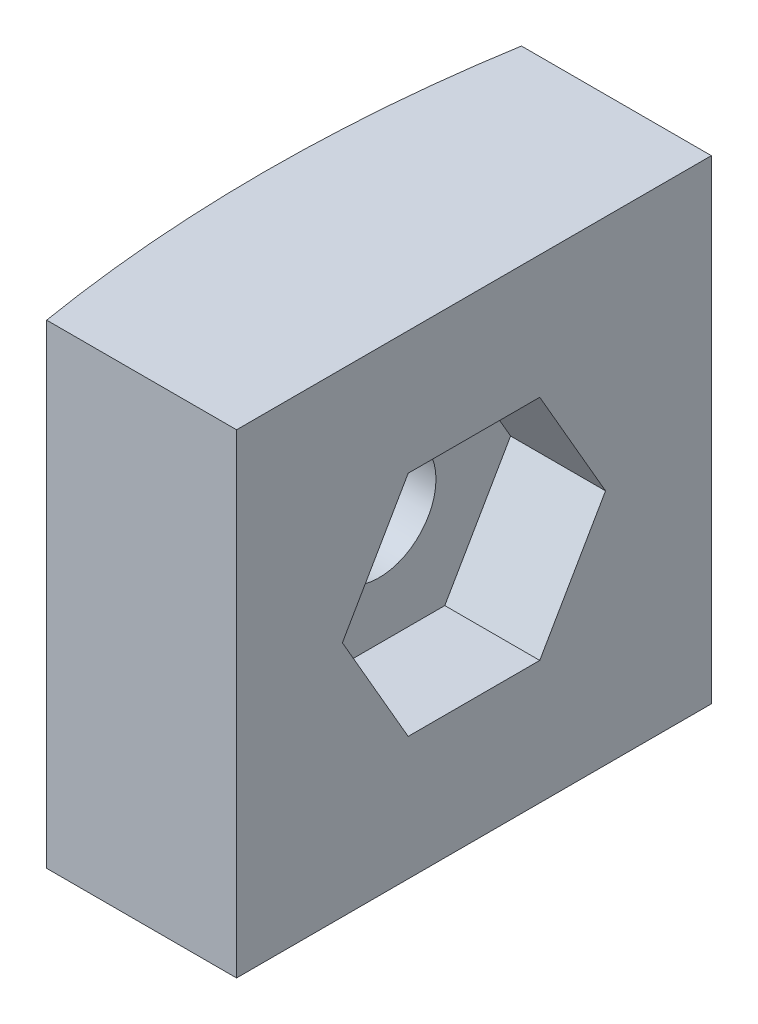
ISO-10303-21;
HEADER;
FILE_DESCRIPTION(('STEP AP214'),'2;1');
FILE_NAME('part.step','',(''),(''),'','','');
FILE_SCHEMA(('AUTOMOTIVE_DESIGN { 1 0 10303 214 1 1 1 1 }'));
ENDSEC;
DATA;
#1=APPLICATION_CONTEXT('core data for automotive mechanical design processes');
#2=APPLICATION_PROTOCOL_DEFINITION('international standard','automotive_design',2000,#1);
#3=PRODUCT_CONTEXT('',#1,'mechanical');
#4=PRODUCT('Part','Part','',(#3));
#5=PRODUCT_RELATED_PRODUCT_CATEGORY('part','',(#4));
#6=PRODUCT_DEFINITION_FORMATION('','',#4);
#7=PRODUCT_DEFINITION_CONTEXT('part definition',#1,'design');
#8=PRODUCT_DEFINITION('design','',#6,#7);
#9=PRODUCT_DEFINITION_SHAPE('','',#8);
#10=(LENGTH_UNIT() NAMED_UNIT(*) SI_UNIT(.MILLI.,.METRE.));
#11=(NAMED_UNIT(*) PLANE_ANGLE_UNIT() SI_UNIT($,.RADIAN.));
#12=(NAMED_UNIT(*) SI_UNIT($,.STERADIAN.) SOLID_ANGLE_UNIT());
#13=UNCERTAINTY_MEASURE_WITH_UNIT(LENGTH_MEASURE(1.E-05),#10,'distance_accuracy_value','');
#14=(GEOMETRIC_REPRESENTATION_CONTEXT(3) GLOBAL_UNCERTAINTY_ASSIGNED_CONTEXT((#13)) GLOBAL_UNIT_ASSIGNED_CONTEXT((#10,
#11,#12)) REPRESENTATION_CONTEXT('',''));
#15=CARTESIAN_POINT('',(0.,0.,0.));
#16=DIRECTION('',(0.,0.,1.));
#17=DIRECTION('',(1.,0.,0.));
#18=AXIS2_PLACEMENT_3D('',#15,#16,#17);
#19=CARTESIAN_POINT('',(-65.504745345666,25.,-11.4783815242943));
#20=DIRECTION('',(0.,0.,1.));
#21=DIRECTION('',(1.,0.,0.));
#22=AXIS2_PLACEMENT_3D('',#19,#20,#21);
#23=PLANE('',#22);
#24=DIRECTION('',(-1.,0.,0.));
#25=VECTOR('',#24,1.);
#26=CARTESIAN_POINT('',(-65.504745345666,0.,-11.4783815242943));
#27=LINE('',#26,#25);
#28=CARTESIAN_POINT('',(-60.504745345666,0.,-11.4783815242943));
#29=VERTEX_POINT('',#28);
#30=CARTESIAN_POINT('',(-70.504745345666,0.,-11.4783815242943));
#31=VERTEX_POINT('',#30);
#32=EDGE_CURVE('E77',#29,#31,#27,.T.);
#33=ORIENTED_EDGE('',*,*,#32,.T.);
#34=DIRECTION('',(0.,-1.,0.));
#35=VECTOR('',#34,1.);
#36=CARTESIAN_POINT('',(-70.504745345666,25.,-11.4783815242943));
#37=LINE('',#36,#35);
#38=CARTESIAN_POINT('',(-70.504745345666,25.,-11.4783815242943));
#39=VERTEX_POINT('',#38);
#40=EDGE_CURVE('E11',#39,#31,#37,.T.);
#41=ORIENTED_EDGE('',*,*,#40,.F.);
#42=DIRECTION('',(-1.,0.,0.));
#43=VECTOR('',#42,1.);
#44=CARTESIAN_POINT('',(-65.504745345666,25.,-11.4783815242943));
#45=LINE('',#44,#43);
#46=CARTESIAN_POINT('',(-60.504745345666,25.,-11.4783815242943));
#47=VERTEX_POINT('',#46);
#48=EDGE_CURVE('E90',#47,#39,#45,.T.);
#49=ORIENTED_EDGE('',*,*,#48,.F.);
#50=DIRECTION('',(0.,1.,0.));
#51=VECTOR('',#50,1.);
#52=CARTESIAN_POINT('',(-60.504745345666,25.,-11.4783815242943));
#53=LINE('',#52,#51);
#54=EDGE_CURVE('E137',#29,#47,#53,.T.);
#55=ORIENTED_EDGE('',*,*,#54,.F.);
#56=EDGE_LOOP('',(#33,#41,#49,#55));
#57=FACE_BOUND('',#56,.T.);
#58=ADVANCED_FACE('F33',(#57),#23,.F.);
#59=CARTESIAN_POINT('',(4.6630003967733,25.,1.02161847570574));
#60=DIRECTION('',(0.,-1.,0.));
#61=DIRECTION('',(0.,0.,-1.));
#62=AXIS2_PLACEMENT_3D('',#59,#60,#61);
#63=CYLINDRICAL_SURFACE('',#62,76.2);
#64=CARTESIAN_POINT('',(-71.4779215834602,12.5,-1.97838152429426));
#65=CARTESIAN_POINT('',(-71.4779223791835,12.6684412410957,-1.97837407626421));
#66=CARTESIAN_POINT('',(-71.4784865352579,12.8370029558818,-1.96414766882511));
#67=CARTESIAN_POINT('',(-71.4806826865875,13.1694793004812,-1.90759581760817));
#68=CARTESIAN_POINT('',(-71.4823159503,13.3333881685322,-1.86523699486931));
#69=CARTESIAN_POINT('',(-71.4864650192497,13.6516942659507,-1.75363235331121));
#70=CARTESIAN_POINT('',(-71.4889803853069,13.8060961837375,-1.68439991246423));
#71=CARTESIAN_POINT('',(-71.4946096692025,14.1010440402986,-1.5210330359289));
#72=CARTESIAN_POINT('',(-71.4977234428412,14.2415933048603,-1.42690459743609));
#73=CARTESIAN_POINT('',(-71.5042011314695,14.5049847229862,-1.21634467104541));
#74=CARTESIAN_POINT('',(-71.5075651926932,14.627816399668,-1.09990008100219));
#75=CARTESIAN_POINT('',(-71.5141629781209,14.8521970571698,-0.848038161265433));
#76=CARTESIAN_POINT('',(-71.5173966970777,14.9537451818938,-0.712620068759224));
#77=CARTESIAN_POINT('',(-71.5233702921472,15.1327000000221,-0.426606713137542));
#78=CARTESIAN_POINT('',(-71.5261100166634,15.2100992879657,-0.276006813078393));
#79=CARTESIAN_POINT('',(-71.5307854831212,15.3385115956986,0.0360623740424597));
#80=CARTESIAN_POINT('',(-71.5327212294474,15.3895247593856,0.197531601822417));
#81=CARTESIAN_POINT('',(-71.5355696561206,15.4636911399376,0.526666440487999));
#82=CARTESIAN_POINT('',(-71.5364828711725,15.4868589182555,0.694328765433289));
#83=CARTESIAN_POINT('',(-71.5371850990962,15.5047217847356,1.03116508290998));
#84=CARTESIAN_POINT('',(-71.5369741182261,15.4994170313968,1.20033906702114));
#85=CARTESIAN_POINT('',(-71.5354521872631,15.4604975878984,1.53529786937751));
#86=CARTESIAN_POINT('',(-71.5341418468294,15.4268985885142,1.70108451391378));
#87=CARTESIAN_POINT('',(-71.5305695429985,15.3323687045179,2.02466254071024));
#88=CARTESIAN_POINT('',(-71.5283075767342,15.2714377375573,2.18245389887983));
#89=CARTESIAN_POINT('',(-71.5230858484435,15.1239555635658,2.48561278576851));
#90=CARTESIAN_POINT('',(-71.5201258910674,15.0373971823457,2.63097682085317));
#91=CARTESIAN_POINT('',(-71.5138416621374,14.8411225325387,2.90511646763926));
#92=CARTESIAN_POINT('',(-71.5105173890436,14.7314061660684,3.03389200922129));
#93=CARTESIAN_POINT('',(-71.5038763901206,14.4918412253314,3.27129068139133));
#94=CARTESIAN_POINT('',(-71.5005596709443,14.3619790390683,3.3799000764343));
#95=CARTESIAN_POINT('',(-71.4943099744649,14.085856695502,3.57377766450101));
#96=CARTESIAN_POINT('',(-71.4913769972384,13.939596534929,3.65904585287052));
#97=CARTESIAN_POINT('',(-71.4862256831765,13.6348220698647,3.80381920822661));
#98=CARTESIAN_POINT('',(-71.4840073594999,13.4763075398039,3.86332390084437));
#99=CARTESIAN_POINT('',(-71.4805360288411,13.1515275791352,3.95487216951777));
#100=CARTESIAN_POINT('',(-71.4792830173507,12.9852621847289,3.98691587382067));
#101=CARTESIAN_POINT('',(-71.4778844284352,12.6498197241709,4.02261565477156));
#102=CARTESIAN_POINT('',(-71.4777381080826,12.4806446877541,4.02629077542969));
#103=CARTESIAN_POINT('',(-71.478567462197,12.1440801577018,4.00519872229129));
#104=CARTESIAN_POINT('',(-71.4795431343858,11.9766906604419,3.98043160624097));
#105=CARTESIAN_POINT('',(-71.4825058167939,11.6485020640001,3.90317390868784));
#106=CARTESIAN_POINT('',(-71.4844925103674,11.4877009184144,3.85069200709052));
#107=CARTESIAN_POINT('',(-71.4892530234883,11.1771906569888,3.71950329818787));
#108=CARTESIAN_POINT('',(-71.4920268458307,11.0274815805368,3.6407963977631));
#109=CARTESIAN_POINT('',(-71.4980507592919,10.7433174674153,3.45934288802212));
#110=CARTESIAN_POINT('',(-71.5013011039133,10.6088706179911,3.35658346565843));
#111=CARTESIAN_POINT('',(-71.5079107799693,10.3591296976402,3.12996064880762));
#112=CARTESIAN_POINT('',(-71.5112701118516,10.2438357054238,3.00609716759575));
#113=CARTESIAN_POINT('',(-71.517721258469,10.0356095293102,2.74070059962868));
#114=CARTESIAN_POINT('',(-71.5208129256085,9.94268963324917,2.59915786795123));
#115=CARTESIAN_POINT('',(-71.5263781595644,9.78193329025788,2.30246966223248));
#116=CARTESIAN_POINT('',(-71.528851728303,9.71409676532,2.14732423049651));
#117=CARTESIAN_POINT('',(-71.5329012502267,9.60545433631828,1.82788071123102));
#118=CARTESIAN_POINT('',(-71.5344774663705,9.56464051299399,1.66358532049953));
#119=CARTESIAN_POINT('',(-71.5365556643637,9.51117609035381,1.33046763983894));
#120=CARTESIAN_POINT('',(-71.5370576492328,9.49852541187114,1.16164536263629));
#121=CARTESIAN_POINT('',(-71.5369308217157,9.5017472760387,0.824388499979557));
#122=CARTESIAN_POINT('',(-71.5363027750645,9.51760050379119,0.655953729375863));
#123=CARTESIAN_POINT('',(-71.5339881305341,9.57734033903583,0.324138664467058));
#124=CARTESIAN_POINT('',(-71.5323015305943,9.62122700109815,0.16075838000171));
#125=CARTESIAN_POINT('',(-71.5280596623478,9.73578447538113,-0.156315317983527));
#126=CARTESIAN_POINT('',(-71.5255043820423,9.80645565757024,-0.310008597664832));
#127=CARTESIAN_POINT('',(-71.5198128493205,9.97257157532319,-0.60334765344264));
#128=CARTESIAN_POINT('',(-71.5166766166216,10.0680154701514,-0.742993906043622));
#129=CARTESIAN_POINT('',(-71.5101740732465,10.2810324665853,-1.00436868827755));
#130=CARTESIAN_POINT('',(-71.5068076323944,10.3986181557225,-1.12608695542022));
#131=CARTESIAN_POINT('',(-71.5002246444016,10.6525890682001,-1.34809079751844));
#132=CARTESIAN_POINT('',(-71.4970081344846,10.7889789271738,-1.44837107195033));
#133=CARTESIAN_POINT('',(-71.4910862235788,11.0767616954103,-1.62468147114229));
#134=CARTESIAN_POINT('',(-71.4883812200234,11.2281661326919,-1.70069277055733));
#135=CARTESIAN_POINT('',(-71.4837941577894,11.5414829773977,-1.82612728145381));
#136=CARTESIAN_POINT('',(-71.4819111220437,11.7033826447252,-1.87558207665013));
#137=CARTESIAN_POINT('',(-71.479681758016,11.9719152230185,-1.93344802536783));
#138=CARTESIAN_POINT('',(-71.4790245777926,12.0768065764502,-1.95027675972112));
#139=CARTESIAN_POINT('',(-71.4781442399397,12.2877826772794,-1.97274585274192));
#140=CARTESIAN_POINT('',(-71.4779210820855,12.3938674240594,-1.97838621719851));
#141=CARTESIAN_POINT('',(-71.4779215834602,12.5,-1.97838152429426));
#142=B_SPLINE_CURVE_WITH_KNOTS('',3,(#64,#65,#66,#67,#68,#69,#70,#71,#72,#73,#74,#75,#76,#77,
#78,#79,#80,#81,#82,#83,#84,#85,#86,#87,#88,#89,#90,#91,#92,#93,#94,#95,#96,#97,#98,#99,#100,
#101,#102,#103,#104,#105,#106,#107,#108,#109,#110,#111,#112,#113,#114,#115,#116,#117,#118,#119,
#120,#121,#122,#123,#124,#125,#126,#127,#128,#129,#130,#131,#132,#133,#134,#135,#136,#137,#138,
#139,#140,#141),.UNSPECIFIED.,.T.,.F.,(4,2,2,2,2,2,2,2,2,2,2,2,2,2,2,2,2,2,2,2,2,2,2,2,2,2,2,2,
2,2,2,2,2,2,2,2,2,2,4),(0.,0.504936314698829,1.01047280650805,1.5157579589704,2.02092150400216,
2.52638255176425,3.03186392696909,3.5375001606292,4.04313363675254,4.54850258193265,
5.05386871385969,5.55895477581716,6.06404235955899,6.56927147242995,7.07450272082898,
7.58007683948578,8.08565105895381,8.59123458688073,9.0968157536378,9.60205749100909,
10.1072982025907,10.6123807732028,11.1174651372757,11.6228191802746,12.1281753000188,
12.6338083311415,13.1394397897665,13.6449230026043,14.1504047945241,14.6555441895202,
15.1606845678287,15.6658319237802,16.1709621382961,16.6763803892859,17.1819234603067,
17.6878577316328,18.193188953912,18.5113427453767,18.8294963722221),.UNSPECIFIED.);
#143=CARTESIAN_POINT('',(-71.4779215834602,12.5,-1.97838152429426));
#144=VERTEX_POINT('',#143);
#145=EDGE_CURVE('E95',#144,#144,#142,.T.);
#146=ORIENTED_EDGE('',*,*,#145,.T.);
#147=EDGE_LOOP('',(#146));
#148=FACE_BOUND('',#147,.T.);
#149=CARTESIAN_POINT('',(4.6630003967733,0.,1.02161847570574));
#150=DIRECTION('',(0.,1.,0.));
#151=DIRECTION('',(0.,0.,1.));
#152=AXIS2_PLACEMENT_3D('',#149,#150,#151);
#153=CIRCLE('',#152,76.2);
#154=CARTESIAN_POINT('',(-70.504745345666,0.,13.5216184757057));
#155=VERTEX_POINT('',#154);
#156=EDGE_CURVE('E67',#31,#155,#153,.T.);
#157=ORIENTED_EDGE('',*,*,#156,.T.);
#158=DIRECTION('',(0.,-1.,0.));
#159=VECTOR('',#158,1.);
#160=CARTESIAN_POINT('',(-70.504745345666,25.,13.5216184757057));
#161=LINE('',#160,#159);
#162=CARTESIAN_POINT('',(-70.504745345666,25.,13.5216184757057));
#163=VERTEX_POINT('',#162);
#164=EDGE_CURVE('E40',#163,#155,#161,.T.);
#165=ORIENTED_EDGE('',*,*,#164,.F.);
#166=CARTESIAN_POINT('',(4.6630003967733,25.,1.02161847570574));
#167=DIRECTION('',(0.,1.,0.));
#168=DIRECTION('',(0.,0.,1.));
#169=AXIS2_PLACEMENT_3D('',#166,#167,#168);
#170=CIRCLE('',#169,76.2);
#171=EDGE_CURVE('E56',#39,#163,#170,.T.);
#172=ORIENTED_EDGE('',*,*,#171,.F.);
#173=ORIENTED_EDGE('',*,*,#40,.T.);
#174=EDGE_LOOP('',(#157,#165,#172,#173));
#175=FACE_BOUND('',#174,.T.);
#176=ADVANCED_FACE('F69',(#148,#175),#63,.T.);
#177=CARTESIAN_POINT('',(-65.504745345666,25.,13.5216184757057));
#178=DIRECTION('',(0.,0.,-1.));
#179=DIRECTION('',(-1.,0.,0.));
#180=AXIS2_PLACEMENT_3D('',#177,#178,#179);
#181=PLANE('',#180);
#182=DIRECTION('',(1.,0.,0.));
#183=VECTOR('',#182,1.);
#184=CARTESIAN_POINT('',(-65.504745345666,0.,13.5216184757057));
#185=LINE('',#184,#183);
#186=CARTESIAN_POINT('',(-60.504745345666,0.,13.5216184757057));
#187=VERTEX_POINT('',#186);
#188=EDGE_CURVE('E76',#155,#187,#185,.T.);
#189=ORIENTED_EDGE('',*,*,#188,.T.);
#190=DIRECTION('',(0.,-1.,0.));
#191=VECTOR('',#190,1.);
#192=CARTESIAN_POINT('',(-60.504745345666,25.,13.5216184757057));
#193=LINE('',#192,#191);
#194=CARTESIAN_POINT('',(-60.504745345666,25.,13.5216184757057));
#195=VERTEX_POINT('',#194);
#196=EDGE_CURVE('E144',#195,#187,#193,.T.);
#197=ORIENTED_EDGE('',*,*,#196,.F.);
#198=DIRECTION('',(1.,0.,0.));
#199=VECTOR('',#198,1.);
#200=CARTESIAN_POINT('',(-65.504745345666,25.,13.5216184757057));
#201=LINE('',#200,#199);
#202=EDGE_CURVE('E85',#163,#195,#201,.T.);
#203=ORIENTED_EDGE('',*,*,#202,.F.);
#204=ORIENTED_EDGE('',*,*,#164,.T.);
#205=EDGE_LOOP('',(#189,#197,#203,#204));
#206=FACE_BOUND('',#205,.T.);
#207=ADVANCED_FACE('F81',(#206),#181,.F.);
#208=CARTESIAN_POINT('',(-65.504745345666,25.,-11.4783815242943));
#209=DIRECTION('',(-1.,0.,0.));
#210=DIRECTION('',(0.,0.,1.));
#211=AXIS2_PLACEMENT_3D('',#208,#209,#210);
#212=PLANE('',#211);
#213=DIRECTION('',(0.,-0.866025403784439,-0.5));
#214=VECTOR('',#213,1.);
#215=CARTESIAN_POINT('',(-65.504745345666,12.5,7.94982170598125));
#216=LINE('',#215,#214);
#217=CARTESIAN_POINT('',(-65.504745345666,12.5,7.94982170598125));
#218=VERTEX_POINT('',#217);
#219=CARTESIAN_POINT('',(-65.504745345666,6.5,4.4857200908435));
#220=VERTEX_POINT('',#219);
#221=EDGE_CURVE('E169',#218,#220,#216,.T.);
#222=ORIENTED_EDGE('',*,*,#221,.T.);
#223=DIRECTION('',(0.,0.,-1.));
#224=VECTOR('',#223,1.);
#225=CARTESIAN_POINT('',(-65.504745345666,6.5,4.4857200908435));
#226=LINE('',#225,#224);
#227=CARTESIAN_POINT('',(-65.504745345666,6.5,-2.44248313943202));
#228=VERTEX_POINT('',#227);
#229=EDGE_CURVE('E47',#220,#228,#226,.T.);
#230=ORIENTED_EDGE('',*,*,#229,.T.);
#231=DIRECTION('',(0.,0.866025403784439,-0.5));
#232=VECTOR('',#231,1.);
#233=CARTESIAN_POINT('',(-65.504745345666,6.5,-2.44248313943202));
#234=LINE('',#233,#232);
#235=CARTESIAN_POINT('',(-65.504745345666,12.5,-5.90658475456977));
#236=VERTEX_POINT('',#235);
#237=EDGE_CURVE('E181',#228,#236,#234,.T.);
#238=ORIENTED_EDGE('',*,*,#237,.T.);
#239=DIRECTION('',(0.,0.866025403784439,0.5));
#240=VECTOR('',#239,1.);
#241=CARTESIAN_POINT('',(-65.504745345666,12.5,-5.90658475456977));
#242=LINE('',#241,#240);
#243=CARTESIAN_POINT('',(-65.504745345666,18.5,-2.44248313943202));
#244=VERTEX_POINT('',#243);
#245=EDGE_CURVE('E178',#236,#244,#242,.T.);
#246=ORIENTED_EDGE('',*,*,#245,.T.);
#247=DIRECTION('',(0.,0.,1.));
#248=VECTOR('',#247,1.);
#249=CARTESIAN_POINT('',(-65.504745345666,18.5,-2.44248313943202));
#250=LINE('',#249,#248);
#251=CARTESIAN_POINT('',(-65.504745345666,18.5,4.48572009084349));
#252=VERTEX_POINT('',#251);
#253=EDGE_CURVE('E175',#244,#252,#250,.T.);
#254=ORIENTED_EDGE('',*,*,#253,.T.);
#255=DIRECTION('',(0.,-0.866025403784439,0.5));
#256=VECTOR('',#255,1.);
#257=CARTESIAN_POINT('',(-65.504745345666,18.5,4.48572009084349));
#258=LINE('',#257,#256);
#259=EDGE_CURVE('E172',#252,#218,#258,.T.);
#260=ORIENTED_EDGE('',*,*,#259,.T.);
#261=EDGE_LOOP('',(#222,#230,#238,#246,#254,#260));
#262=FACE_BOUND('',#261,.T.);
#263=CARTESIAN_POINT('',(-65.504745345666,12.5,1.02161847570574));
#264=DIRECTION('',(1.,0.,0.));
#265=DIRECTION('',(0.,0.,-1.));
#266=AXIS2_PLACEMENT_3D('',#263,#264,#265);
#267=CIRCLE('',#266,3.);
#268=CARTESIAN_POINT('',(-65.504745345666,12.5,-1.97838152429426));
#269=VERTEX_POINT('',#268);
#270=EDGE_CURVE('E104',#269,#269,#267,.T.);
#271=ORIENTED_EDGE('',*,*,#270,.F.);
#272=EDGE_LOOP('',(#271));
#273=FACE_BOUND('',#272,.T.);
#274=ADVANCED_FACE('F119',(#262,#273),#212,.F.);
#275=CARTESIAN_POINT('',(4.6630003967733,25.,1.02161847570574));
#276=DIRECTION('',(0.,1.,0.));
#277=DIRECTION('',(0.,0.,1.));
#278=AXIS2_PLACEMENT_3D('',#275,#276,#277);
#279=PLANE('',#278);
#280=ORIENTED_EDGE('',*,*,#48,.T.);
#281=ORIENTED_EDGE('',*,*,#171,.T.);
#282=ORIENTED_EDGE('',*,*,#202,.T.);
#283=DIRECTION('',(0.,0.,1.));
#284=VECTOR('',#283,1.);
#285=CARTESIAN_POINT('',(-60.504745345666,25.,13.5216184757057));
#286=LINE('',#285,#284);
#287=EDGE_CURVE('E146',#47,#195,#286,.T.);
#288=ORIENTED_EDGE('',*,*,#287,.F.);
#289=EDGE_LOOP('',(#280,#281,#282,#288));
#290=FACE_BOUND('',#289,.T.);
#291=ADVANCED_FACE('F116',(#290),#279,.T.);
#292=CARTESIAN_POINT('',(4.6630003967733,0.,1.02161847570574));
#293=DIRECTION('',(0.,1.,0.));
#294=DIRECTION('',(0.,0.,1.));
#295=AXIS2_PLACEMENT_3D('',#292,#293,#294);
#296=PLANE('',#295);
#297=ORIENTED_EDGE('',*,*,#32,.F.);
#298=DIRECTION('',(0.,0.,-1.));
#299=VECTOR('',#298,1.);
#300=CARTESIAN_POINT('',(-60.504745345666,0.,13.5216184757057));
#301=LINE('',#300,#299);
#302=EDGE_CURVE('E89',#187,#29,#301,.T.);
#303=ORIENTED_EDGE('',*,*,#302,.F.);
#304=ORIENTED_EDGE('',*,*,#188,.F.);
#305=ORIENTED_EDGE('',*,*,#156,.F.);
#306=EDGE_LOOP('',(#297,#303,#304,#305));
#307=FACE_BOUND('',#306,.T.);
#308=ADVANCED_FACE('F87',(#307),#296,.F.);
#309=CARTESIAN_POINT('',(-90.504745345666,12.5,1.02161847570574));
#310=DIRECTION('',(1.,0.,0.));
#311=DIRECTION('',(0.,0.,-1.));
#312=AXIS2_PLACEMENT_3D('',#309,#310,#311);
#313=CYLINDRICAL_SURFACE('',#312,3.);
#314=ORIENTED_EDGE('',*,*,#270,.T.);
#315=EDGE_LOOP('',(#314));
#316=FACE_BOUND('',#315,.T.);
#317=ORIENTED_EDGE('',*,*,#145,.F.);
#318=EDGE_LOOP('',(#317));
#319=FACE_BOUND('',#318,.T.);
#320=ADVANCED_FACE('F108',(#316,#319),#313,.F.);
#321=CARTESIAN_POINT('',(-60.504745345666,0.,0.));
#322=DIRECTION('',(-1.,0.,0.));
#323=DIRECTION('',(0.,0.,1.));
#324=AXIS2_PLACEMENT_3D('',#321,#322,#323);
#325=PLANE('',#324);
#326=ORIENTED_EDGE('',*,*,#287,.T.);
#327=ORIENTED_EDGE('',*,*,#196,.T.);
#328=ORIENTED_EDGE('',*,*,#302,.T.);
#329=ORIENTED_EDGE('',*,*,#54,.T.);
#330=EDGE_LOOP('',(#326,#327,#328,#329));
#331=FACE_BOUND('',#330,.T.);
#332=DIRECTION('',(0.,0.866025403784439,-0.5));
#333=VECTOR('',#332,1.);
#334=CARTESIAN_POINT('',(-60.504745345666,6.5,-2.44248313943202));
#335=LINE('',#334,#333);
#336=CARTESIAN_POINT('',(-60.504745345666,6.5,-2.44248313943202));
#337=VERTEX_POINT('',#336);
#338=CARTESIAN_POINT('',(-60.504745345666,12.5,-5.90658475456977));
#339=VERTEX_POINT('',#338);
#340=EDGE_CURVE('E168',#337,#339,#335,.T.);
#341=ORIENTED_EDGE('',*,*,#340,.F.);
#342=DIRECTION('',(0.,0.,-1.));
#343=VECTOR('',#342,1.);
#344=CARTESIAN_POINT('',(-60.504745345666,6.5,4.4857200908435));
#345=LINE('',#344,#343);
#346=CARTESIAN_POINT('',(-60.504745345666,6.5,4.4857200908435));
#347=VERTEX_POINT('',#346);
#348=EDGE_CURVE('E166',#347,#337,#345,.T.);
#349=ORIENTED_EDGE('',*,*,#348,.F.);
#350=DIRECTION('',(0.,-0.866025403784439,-0.5));
#351=VECTOR('',#350,1.);
#352=CARTESIAN_POINT('',(-60.504745345666,12.5,7.94982170598125));
#353=LINE('',#352,#351);
#354=CARTESIAN_POINT('',(-60.504745345666,12.5,7.94982170598125));
#355=VERTEX_POINT('',#354);
#356=EDGE_CURVE('E186',#355,#347,#353,.T.);
#357=ORIENTED_EDGE('',*,*,#356,.F.);
#358=DIRECTION('',(0.,-0.866025403784439,0.5));
#359=VECTOR('',#358,1.);
#360=CARTESIAN_POINT('',(-60.504745345666,18.5,4.48572009084349));
#361=LINE('',#360,#359);
#362=CARTESIAN_POINT('',(-60.504745345666,18.5,4.48572009084349));
#363=VERTEX_POINT('',#362);
#364=EDGE_CURVE('E189',#363,#355,#361,.T.);
#365=ORIENTED_EDGE('',*,*,#364,.F.);
#366=DIRECTION('',(0.,0.,1.));
#367=VECTOR('',#366,1.);
#368=CARTESIAN_POINT('',(-60.504745345666,18.5,-2.44248313943202));
#369=LINE('',#368,#367);
#370=CARTESIAN_POINT('',(-60.504745345666,18.5,-2.44248313943202));
#371=VERTEX_POINT('',#370);
#372=EDGE_CURVE('E192',#371,#363,#369,.T.);
#373=ORIENTED_EDGE('',*,*,#372,.F.);
#374=DIRECTION('',(0.,0.866025403784439,0.5));
#375=VECTOR('',#374,1.);
#376=CARTESIAN_POINT('',(-60.504745345666,12.5,-5.90658475456977));
#377=LINE('',#376,#375);
#378=EDGE_CURVE('E195',#339,#371,#377,.T.);
#379=ORIENTED_EDGE('',*,*,#378,.F.);
#380=EDGE_LOOP('',(#341,#349,#357,#365,#373,#379));
#381=FACE_BOUND('',#380,.T.);
#382=ADVANCED_FACE('F113',(#331,#381),#325,.F.);
#383=CARTESIAN_POINT('',(-60.504745345666,6.5,-2.44248313943202));
#384=DIRECTION('',(0.,0.5,0.866025403784439));
#385=DIRECTION('',(0.,-0.866025403784439,0.5));
#386=AXIS2_PLACEMENT_3D('',#383,#384,#385);
#387=PLANE('',#386);
#388=ORIENTED_EDGE('',*,*,#237,.F.);
#389=DIRECTION('',(-1.,0.,0.));
#390=VECTOR('',#389,1.);
#391=CARTESIAN_POINT('',(-60.504745345666,6.5,-2.44248313943202));
#392=LINE('',#391,#390);
#393=EDGE_CURVE('E164',#337,#228,#392,.T.);
#394=ORIENTED_EDGE('',*,*,#393,.F.);
#395=ORIENTED_EDGE('',*,*,#340,.T.);
#396=DIRECTION('',(-1.,0.,0.));
#397=VECTOR('',#396,1.);
#398=CARTESIAN_POINT('',(-60.504745345666,12.5,-5.90658475456977));
#399=LINE('',#398,#397);
#400=EDGE_CURVE('E150',#339,#236,#399,.T.);
#401=ORIENTED_EDGE('',*,*,#400,.T.);
#402=EDGE_LOOP('',(#388,#394,#395,#401));
#403=FACE_BOUND('',#402,.T.);
#404=ADVANCED_FACE('F205',(#403),#387,.T.);
#405=CARTESIAN_POINT('',(-60.504745345666,12.5,-5.90658475456977));
#406=DIRECTION('',(0.,-0.5,0.866025403784439));
#407=DIRECTION('',(0.,-0.866025403784439,-0.5));
#408=AXIS2_PLACEMENT_3D('',#405,#406,#407);
#409=PLANE('',#408);
#410=ORIENTED_EDGE('',*,*,#245,.F.);
#411=ORIENTED_EDGE('',*,*,#400,.F.);
#412=ORIENTED_EDGE('',*,*,#378,.T.);
#413=DIRECTION('',(-1.,0.,0.));
#414=VECTOR('',#413,1.);
#415=CARTESIAN_POINT('',(-60.504745345666,18.5,-2.44248313943202));
#416=LINE('',#415,#414);
#417=EDGE_CURVE('E153',#371,#244,#416,.T.);
#418=ORIENTED_EDGE('',*,*,#417,.T.);
#419=EDGE_LOOP('',(#410,#411,#412,#418));
#420=FACE_BOUND('',#419,.T.);
#421=ADVANCED_FACE('F215',(#420),#409,.T.);
#422=CARTESIAN_POINT('',(-60.504745345666,18.5,-2.44248313943202));
#423=DIRECTION('',(0.,-1.,0.));
#424=DIRECTION('',(0.,0.,-1.));
#425=AXIS2_PLACEMENT_3D('',#422,#423,#424);
#426=PLANE('',#425);
#427=ORIENTED_EDGE('',*,*,#253,.F.);
#428=ORIENTED_EDGE('',*,*,#417,.F.);
#429=ORIENTED_EDGE('',*,*,#372,.T.);
#430=DIRECTION('',(-1.,0.,0.));
#431=VECTOR('',#430,1.);
#432=CARTESIAN_POINT('',(-60.504745345666,18.5,4.48572009084349));
#433=LINE('',#432,#431);
#434=EDGE_CURVE('E156',#363,#252,#433,.T.);
#435=ORIENTED_EDGE('',*,*,#434,.T.);
#436=EDGE_LOOP('',(#427,#428,#429,#435));
#437=FACE_BOUND('',#436,.T.);
#438=ADVANCED_FACE('F225',(#437),#426,.T.);
#439=CARTESIAN_POINT('',(-60.504745345666,18.5,4.48572009084349));
#440=DIRECTION('',(0.,-0.5,-0.866025403784439));
#441=DIRECTION('',(0.,0.866025403784439,-0.5));
#442=AXIS2_PLACEMENT_3D('',#439,#440,#441);
#443=PLANE('',#442);
#444=ORIENTED_EDGE('',*,*,#259,.F.);
#445=ORIENTED_EDGE('',*,*,#434,.F.);
#446=ORIENTED_EDGE('',*,*,#364,.T.);
#447=DIRECTION('',(-1.,0.,0.));
#448=VECTOR('',#447,1.);
#449=CARTESIAN_POINT('',(-60.504745345666,12.5,7.94982170598125));
#450=LINE('',#449,#448);
#451=EDGE_CURVE('E159',#355,#218,#450,.T.);
#452=ORIENTED_EDGE('',*,*,#451,.T.);
#453=EDGE_LOOP('',(#444,#445,#446,#452));
#454=FACE_BOUND('',#453,.T.);
#455=ADVANCED_FACE('F231',(#454),#443,.T.);
#456=CARTESIAN_POINT('',(-60.504745345666,12.5,7.94982170598125));
#457=DIRECTION('',(0.,0.5,-0.866025403784439));
#458=DIRECTION('',(0.,0.866025403784439,0.5));
#459=AXIS2_PLACEMENT_3D('',#456,#457,#458);
#460=PLANE('',#459);
#461=ORIENTED_EDGE('',*,*,#221,.F.);
#462=ORIENTED_EDGE('',*,*,#451,.F.);
#463=ORIENTED_EDGE('',*,*,#356,.T.);
#464=DIRECTION('',(-1.,0.,0.));
#465=VECTOR('',#464,1.);
#466=CARTESIAN_POINT('',(-60.504745345666,6.5,4.4857200908435));
#467=LINE('',#466,#465);
#468=EDGE_CURVE('E162',#347,#220,#467,.T.);
#469=ORIENTED_EDGE('',*,*,#468,.T.);
#470=EDGE_LOOP('',(#461,#462,#463,#469));
#471=FACE_BOUND('',#470,.T.);
#472=ADVANCED_FACE('F249',(#471),#460,.T.);
#473=CARTESIAN_POINT('',(-60.504745345666,6.5,4.4857200908435));
#474=DIRECTION('',(0.,1.,0.));
#475=DIRECTION('',(0.,0.,1.));
#476=AXIS2_PLACEMENT_3D('',#473,#474,#475);
#477=PLANE('',#476);
#478=ORIENTED_EDGE('',*,*,#229,.F.);
#479=ORIENTED_EDGE('',*,*,#468,.F.);
#480=ORIENTED_EDGE('',*,*,#348,.T.);
#481=ORIENTED_EDGE('',*,*,#393,.T.);
#482=EDGE_LOOP('',(#478,#479,#480,#481));
#483=FACE_BOUND('',#482,.T.);
#484=ADVANCED_FACE('F247',(#483),#477,.T.);
#485=CLOSED_SHELL('',(#58,#176,#207,#274,#291,#308,#320,#382,#404,#421,#438,#455,#472,#484));
#486=MANIFOLD_SOLID_BREP('B2',#485);
#487=ADVANCED_BREP_SHAPE_REPRESENTATION('',(#18,#486),#14);
#488=SHAPE_DEFINITION_REPRESENTATION(#9,#487);
ENDSEC;
END-ISO-10303-21;
